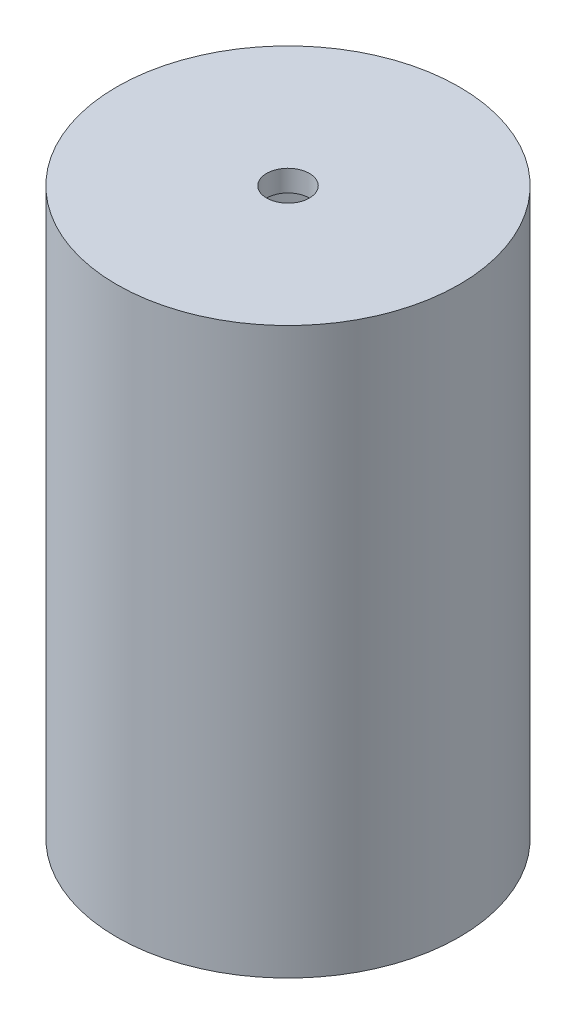
ISO-10303-21;
HEADER;
FILE_DESCRIPTION(('STEP AP214'),'2;1');
FILE_NAME('part.step','',(''),(''),'','','');
FILE_SCHEMA(('AUTOMOTIVE_DESIGN { 1 0 10303 214 1 1 1 1 }'));
ENDSEC;
DATA;
#1=APPLICATION_CONTEXT('core data for automotive mechanical design processes');
#2=APPLICATION_PROTOCOL_DEFINITION('international standard','automotive_design',2000,#1);
#3=PRODUCT_CONTEXT('',#1,'mechanical');
#4=PRODUCT('Part','Part','',(#3));
#5=PRODUCT_RELATED_PRODUCT_CATEGORY('part','',(#4));
#6=PRODUCT_DEFINITION_FORMATION('','',#4);
#7=PRODUCT_DEFINITION_CONTEXT('part definition',#1,'design');
#8=PRODUCT_DEFINITION('design','',#6,#7);
#9=PRODUCT_DEFINITION_SHAPE('','',#8);
#10=(LENGTH_UNIT() NAMED_UNIT(*) SI_UNIT(.MILLI.,.METRE.));
#11=(NAMED_UNIT(*) PLANE_ANGLE_UNIT() SI_UNIT($,.RADIAN.));
#12=(NAMED_UNIT(*) SI_UNIT($,.STERADIAN.) SOLID_ANGLE_UNIT());
#13=UNCERTAINTY_MEASURE_WITH_UNIT(LENGTH_MEASURE(1.E-05),#10,'distance_accuracy_value','');
#14=(GEOMETRIC_REPRESENTATION_CONTEXT(3) GLOBAL_UNCERTAINTY_ASSIGNED_CONTEXT((#13)) GLOBAL_UNIT_ASSIGNED_CONTEXT((#10,
#11,#12)) REPRESENTATION_CONTEXT('',''));
#15=CARTESIAN_POINT('',(0.,0.,0.));
#16=DIRECTION('',(0.,0.,1.));
#17=DIRECTION('',(1.,0.,0.));
#18=AXIS2_PLACEMENT_3D('',#15,#16,#17);
#19=CARTESIAN_POINT('',(0.,26.4,0.));
#20=DIRECTION('',(0.,-1.,0.));
#21=DIRECTION('',(0.,0.,-1.));
#22=AXIS2_PLACEMENT_3D('',#19,#20,#21);
#23=CYLINDRICAL_SURFACE('',#22,7.);
#24=CARTESIAN_POINT('',(0.,25.4,0.));
#25=DIRECTION('',(0.,1.,0.));
#26=DIRECTION('',(0.,0.,1.));
#27=AXIS2_PLACEMENT_3D('',#24,#25,#26);
#28=CIRCLE('',#27,7.);
#29=CARTESIAN_POINT('',(0.,25.4,7.));
#30=VERTEX_POINT('',#29);
#31=EDGE_CURVE('E10',#30,#30,#28,.T.);
#32=ORIENTED_EDGE('',*,*,#31,.T.);
#33=EDGE_LOOP('',(#32));
#34=FACE_BOUND('',#33,.T.);
#35=CARTESIAN_POINT('',(0.,1.,0.));
#36=DIRECTION('',(0.,1.,0.));
#37=DIRECTION('',(0.,0.,1.));
#38=AXIS2_PLACEMENT_3D('',#35,#36,#37);
#39=CIRCLE('',#38,7.);
#40=CARTESIAN_POINT('',(0.,1.,7.));
#41=VERTEX_POINT('',#40);
#42=EDGE_CURVE('E41',#41,#41,#39,.T.);
#43=ORIENTED_EDGE('',*,*,#42,.F.);
#44=EDGE_LOOP('',(#43));
#45=FACE_BOUND('',#44,.T.);
#46=ADVANCED_FACE('F33',(#34,#45),#23,.F.);
#47=CARTESIAN_POINT('',(0.,25.4,0.));
#48=DIRECTION('',(0.,1.,0.));
#49=DIRECTION('',(0.,0.,1.));
#50=AXIS2_PLACEMENT_3D('',#47,#48,#49);
#51=PLANE('',#50);
#52=CARTESIAN_POINT('',(0.,25.4,0.));
#53=DIRECTION('',(0.,1.,0.));
#54=DIRECTION('',(0.,0.,1.));
#55=AXIS2_PLACEMENT_3D('',#52,#53,#54);
#56=CIRCLE('',#55,1.);
#57=CARTESIAN_POINT('',(0.,25.4,1.));
#58=VERTEX_POINT('',#57);
#59=EDGE_CURVE('E37',#58,#58,#56,.T.);
#60=ORIENTED_EDGE('',*,*,#59,.T.);
#61=EDGE_LOOP('',(#60));
#62=FACE_BOUND('',#61,.T.);
#63=ORIENTED_EDGE('',*,*,#31,.F.);
#64=EDGE_LOOP('',(#63));
#65=FACE_BOUND('',#64,.T.);
#66=ADVANCED_FACE('F88',(#62,#65),#51,.F.);
#67=CARTESIAN_POINT('',(0.,1.,0.));
#68=DIRECTION('',(0.,1.,0.));
#69=DIRECTION('',(0.,0.,1.));
#70=AXIS2_PLACEMENT_3D('',#67,#68,#69);
#71=PLANE('',#70);
#72=CARTESIAN_POINT('',(0.,1.,0.));
#73=DIRECTION('',(0.,1.,0.));
#74=DIRECTION('',(0.,0.,1.));
#75=AXIS2_PLACEMENT_3D('',#72,#73,#74);
#76=CIRCLE('',#75,0.8);
#77=CARTESIAN_POINT('',(0.,1.,0.8));
#78=VERTEX_POINT('',#77);
#79=EDGE_CURVE('E56',#78,#78,#76,.T.);
#80=ORIENTED_EDGE('',*,*,#79,.F.);
#81=EDGE_LOOP('',(#80));
#82=FACE_BOUND('',#81,.T.);
#83=ORIENTED_EDGE('',*,*,#42,.T.);
#84=EDGE_LOOP('',(#83));
#85=FACE_BOUND('',#84,.T.);
#86=ADVANCED_FACE('F35',(#82,#85),#71,.T.);
#87=CARTESIAN_POINT('',(0.,23.4,0.));
#88=DIRECTION('',(0.,1.,0.));
#89=DIRECTION('',(0.,0.,1.));
#90=AXIS2_PLACEMENT_3D('',#87,#88,#89);
#91=CYLINDRICAL_SURFACE('',#90,1.);
#92=CARTESIAN_POINT('',(0.,26.4,0.));
#93=DIRECTION('',(0.,1.,0.));
#94=DIRECTION('',(0.,0.,1.));
#95=AXIS2_PLACEMENT_3D('',#92,#93,#94);
#96=CIRCLE('',#95,1.);
#97=CARTESIAN_POINT('',(0.,26.4,1.));
#98=VERTEX_POINT('',#97);
#99=EDGE_CURVE('E53',#98,#98,#96,.T.);
#100=CARTESIAN_POINT('',(0.,26.4,1.));
#101=CARTESIAN_POINT('',(0.,26.3895833333333,1.));
#102=CARTESIAN_POINT('',(0.,26.3791666666667,1.));
#103=CARTESIAN_POINT('',(0.,26.3583333333333,1.));
#104=CARTESIAN_POINT('',(0.,26.3479166666667,1.));
#105=CARTESIAN_POINT('',(0.,26.3270833333333,1.));
#106=CARTESIAN_POINT('',(0.,26.3166666666667,1.));
#107=CARTESIAN_POINT('',(0.,26.2958333333333,1.));
#108=CARTESIAN_POINT('',(0.,26.2854166666667,1.));
#109=CARTESIAN_POINT('',(0.,26.2645833333333,1.));
#110=CARTESIAN_POINT('',(0.,26.2541666666667,1.));
#111=CARTESIAN_POINT('',(0.,26.2333333333333,1.));
#112=CARTESIAN_POINT('',(0.,26.2229166666667,1.));
#113=CARTESIAN_POINT('',(0.,26.2020833333333,1.));
#114=CARTESIAN_POINT('',(0.,26.1916666666667,1.));
#115=CARTESIAN_POINT('',(0.,26.1708333333333,1.));
#116=CARTESIAN_POINT('',(0.,26.1604166666667,1.));
#117=CARTESIAN_POINT('',(0.,26.1395833333333,1.));
#118=CARTESIAN_POINT('',(0.,26.1291666666667,1.));
#119=CARTESIAN_POINT('',(0.,26.1083333333333,1.));
#120=CARTESIAN_POINT('',(0.,26.0979166666667,1.));
#121=CARTESIAN_POINT('',(0.,26.0770833333333,1.));
#122=CARTESIAN_POINT('',(0.,26.0666666666667,1.));
#123=CARTESIAN_POINT('',(0.,26.0458333333333,1.));
#124=CARTESIAN_POINT('',(0.,26.0354166666667,1.));
#125=CARTESIAN_POINT('',(0.,26.0145833333333,1.));
#126=CARTESIAN_POINT('',(0.,26.0041666666667,1.));
#127=CARTESIAN_POINT('',(0.,25.9833333333333,1.));
#128=CARTESIAN_POINT('',(0.,25.9729166666667,1.));
#129=CARTESIAN_POINT('',(0.,25.9520833333333,1.));
#130=CARTESIAN_POINT('',(0.,25.9416666666667,1.));
#131=CARTESIAN_POINT('',(0.,25.9208333333333,1.));
#132=CARTESIAN_POINT('',(0.,25.9104166666667,1.));
#133=CARTESIAN_POINT('',(0.,25.8895833333333,1.));
#134=CARTESIAN_POINT('',(0.,25.8791666666667,1.));
#135=CARTESIAN_POINT('',(0.,25.8583333333333,1.));
#136=CARTESIAN_POINT('',(0.,25.8479166666667,1.));
#137=CARTESIAN_POINT('',(0.,25.8270833333333,1.));
#138=CARTESIAN_POINT('',(0.,25.8166666666667,1.));
#139=CARTESIAN_POINT('',(0.,25.7958333333333,1.));
#140=CARTESIAN_POINT('',(0.,25.7854166666667,1.));
#141=CARTESIAN_POINT('',(0.,25.7645833333333,1.));
#142=CARTESIAN_POINT('',(0.,25.7541666666667,1.));
#143=CARTESIAN_POINT('',(0.,25.7333333333333,1.));
#144=CARTESIAN_POINT('',(0.,25.7229166666667,1.));
#145=CARTESIAN_POINT('',(0.,25.7020833333333,1.));
#146=CARTESIAN_POINT('',(0.,25.6916666666667,1.));
#147=CARTESIAN_POINT('',(0.,25.6708333333333,1.));
#148=CARTESIAN_POINT('',(0.,25.6604166666667,1.));
#149=CARTESIAN_POINT('',(0.,25.6395833333333,1.));
#150=CARTESIAN_POINT('',(0.,25.6291666666667,1.));
#151=CARTESIAN_POINT('',(0.,25.6083333333333,1.));
#152=CARTESIAN_POINT('',(0.,25.5979166666667,1.));
#153=CARTESIAN_POINT('',(0.,25.5770833333333,1.));
#154=CARTESIAN_POINT('',(0.,25.5666666666667,1.));
#155=CARTESIAN_POINT('',(0.,25.5458333333333,1.));
#156=CARTESIAN_POINT('',(0.,25.5354166666667,1.));
#157=CARTESIAN_POINT('',(0.,25.5145833333333,1.));
#158=CARTESIAN_POINT('',(0.,25.5041666666667,1.));
#159=CARTESIAN_POINT('',(0.,25.4833333333333,1.));
#160=CARTESIAN_POINT('',(0.,25.4729166666667,1.));
#161=CARTESIAN_POINT('',(0.,25.4520833333333,1.));
#162=CARTESIAN_POINT('',(0.,25.4416666666667,1.));
#163=CARTESIAN_POINT('',(0.,25.4208333333333,1.));
#164=CARTESIAN_POINT('',(0.,25.4104166666667,1.));
#165=CARTESIAN_POINT('',(0.,25.4,1.));
#166=B_SPLINE_CURVE_WITH_KNOTS('',3,(#100,#101,#102,#103,#104,#105,#106,#107,#108,#109,#110,
#111,#112,#113,#114,#115,#116,#117,#118,#119,#120,#121,#122,#123,#124,#125,#126,#127,#128,#129,
#130,#131,#132,#133,#134,#135,#136,#137,#138,#139,#140,#141,#142,#143,#144,#145,#146,#147,#148,
#149,#150,#151,#152,#153,#154,#155,#156,#157,#158,#159,#160,#161,#162,#163,#164,#165),
.UNSPECIFIED.,.F.,.F.,(4,2,2,2,2,2,2,2,2,2,2,2,2,2,2,2,2,2,2,2,2,2,2,2,2,2,2,2,2,2,2,2,4),(0.,
0.03125,0.0625000000000001,0.0937500000000001,0.125,0.15625,0.1875,0.21875,0.25,0.28125,0.3125,
0.34375,0.375,0.40625,0.4375,0.46875,0.5,0.53125,0.5625,0.593750000000001,0.625000000000001,
0.656250000000001,0.687500000000001,0.718750000000001,0.750000000000001,0.781250000000001,
0.812500000000001,0.843750000000001,0.875000000000001,0.906250000000001,0.937500000000001,
0.968750000000001,1.),.UNSPECIFIED.);
#167=EDGE_CURVE('BSEAM74',#98,#58,#166,.T.);
#168=ORIENTED_EDGE('',*,*,#99,.T.);
#169=ORIENTED_EDGE('',*,*,#59,.F.);
#170=ORIENTED_EDGE('',*,*,#167,.T.);
#171=ORIENTED_EDGE('',*,*,#167,.F.);
#172=EDGE_LOOP('',(#168,#170,#169,#171));
#173=FACE_BOUND('',#172,.T.);
#174=ADVANCED_FACE('F74',(#173),#91,.F.);
#175=CARTESIAN_POINT('',(0.,26.4,0.));
#176=DIRECTION('',(0.,-1.,0.));
#177=DIRECTION('',(0.,0.,-1.));
#178=AXIS2_PLACEMENT_3D('',#175,#176,#177);
#179=CYLINDRICAL_SURFACE('',#178,8.);
#180=CARTESIAN_POINT('',(0.,26.4,0.));
#181=DIRECTION('',(0.,1.,0.));
#182=DIRECTION('',(0.,0.,1.));
#183=AXIS2_PLACEMENT_3D('',#180,#181,#182);
#184=CIRCLE('',#183,8.);
#185=CARTESIAN_POINT('',(0.,26.4,8.));
#186=VERTEX_POINT('',#185);
#187=EDGE_CURVE('E46',#186,#186,#184,.T.);
#188=ORIENTED_EDGE('',*,*,#187,.F.);
#189=EDGE_LOOP('',(#188));
#190=FACE_BOUND('',#189,.T.);
#191=CARTESIAN_POINT('',(0.,0.,0.));
#192=DIRECTION('',(0.,1.,0.));
#193=DIRECTION('',(0.,0.,1.));
#194=AXIS2_PLACEMENT_3D('',#191,#192,#193);
#195=CIRCLE('',#194,8.);
#196=CARTESIAN_POINT('',(0.,0.,8.));
#197=VERTEX_POINT('',#196);
#198=EDGE_CURVE('E48',#197,#197,#195,.T.);
#199=ORIENTED_EDGE('',*,*,#198,.T.);
#200=EDGE_LOOP('',(#199));
#201=FACE_BOUND('',#200,.T.);
#202=ADVANCED_FACE('F72',(#190,#201),#179,.T.);
#203=CARTESIAN_POINT('',(0.,26.4,0.));
#204=DIRECTION('',(0.,1.,0.));
#205=DIRECTION('',(0.,0.,1.));
#206=AXIS2_PLACEMENT_3D('',#203,#204,#205);
#207=PLANE('',#206);
#208=ORIENTED_EDGE('',*,*,#99,.F.);
#209=EDGE_LOOP('',(#208));
#210=FACE_BOUND('',#209,.T.);
#211=ORIENTED_EDGE('',*,*,#187,.T.);
#212=EDGE_LOOP('',(#211));
#213=FACE_BOUND('',#212,.T.);
#214=ADVANCED_FACE('F68',(#210,#213),#207,.T.);
#215=CARTESIAN_POINT('',(0.,0.,0.));
#216=DIRECTION('',(0.,1.,0.));
#217=DIRECTION('',(0.,0.,1.));
#218=AXIS2_PLACEMENT_3D('',#215,#216,#217);
#219=PLANE('',#218);
#220=CARTESIAN_POINT('',(0.,0.,0.));
#221=DIRECTION('',(0.,-1.,0.));
#222=DIRECTION('',(0.,0.,-1.));
#223=AXIS2_PLACEMENT_3D('',#220,#221,#222);
#224=CIRCLE('',#223,0.8);
#225=CARTESIAN_POINT('',(0.,0.,-0.8));
#226=VERTEX_POINT('',#225);
#227=EDGE_CURVE('E59',#226,#226,#224,.T.);
#228=ORIENTED_EDGE('',*,*,#227,.F.);
#229=EDGE_LOOP('',(#228));
#230=FACE_BOUND('',#229,.T.);
#231=ORIENTED_EDGE('',*,*,#198,.F.);
#232=EDGE_LOOP('',(#231));
#233=FACE_BOUND('',#232,.T.);
#234=ADVANCED_FACE('F65',(#230,#233),#219,.F.);
#235=CARTESIAN_POINT('',(0.,6.,0.));
#236=DIRECTION('',(0.,-1.,0.));
#237=DIRECTION('',(0.,0.,-1.));
#238=AXIS2_PLACEMENT_3D('',#235,#236,#237);
#239=CYLINDRICAL_SURFACE('',#238,0.8);
#240=ORIENTED_EDGE('',*,*,#79,.T.);
#241=EDGE_LOOP('',(#240));
#242=FACE_BOUND('',#241,.T.);
#243=ORIENTED_EDGE('',*,*,#227,.T.);
#244=EDGE_LOOP('',(#243));
#245=FACE_BOUND('',#244,.T.);
#246=ADVANCED_FACE('F63',(#242,#245),#239,.F.);
#247=CLOSED_SHELL('',(#46,#66,#86,#174,#202,#214,#234,#246));
#248=MANIFOLD_SOLID_BREP('B2',#247);
#249=ADVANCED_BREP_SHAPE_REPRESENTATION('',(#18,#248),#14);
#250=SHAPE_DEFINITION_REPRESENTATION(#9,#249);
ENDSEC;
END-ISO-10303-21;
